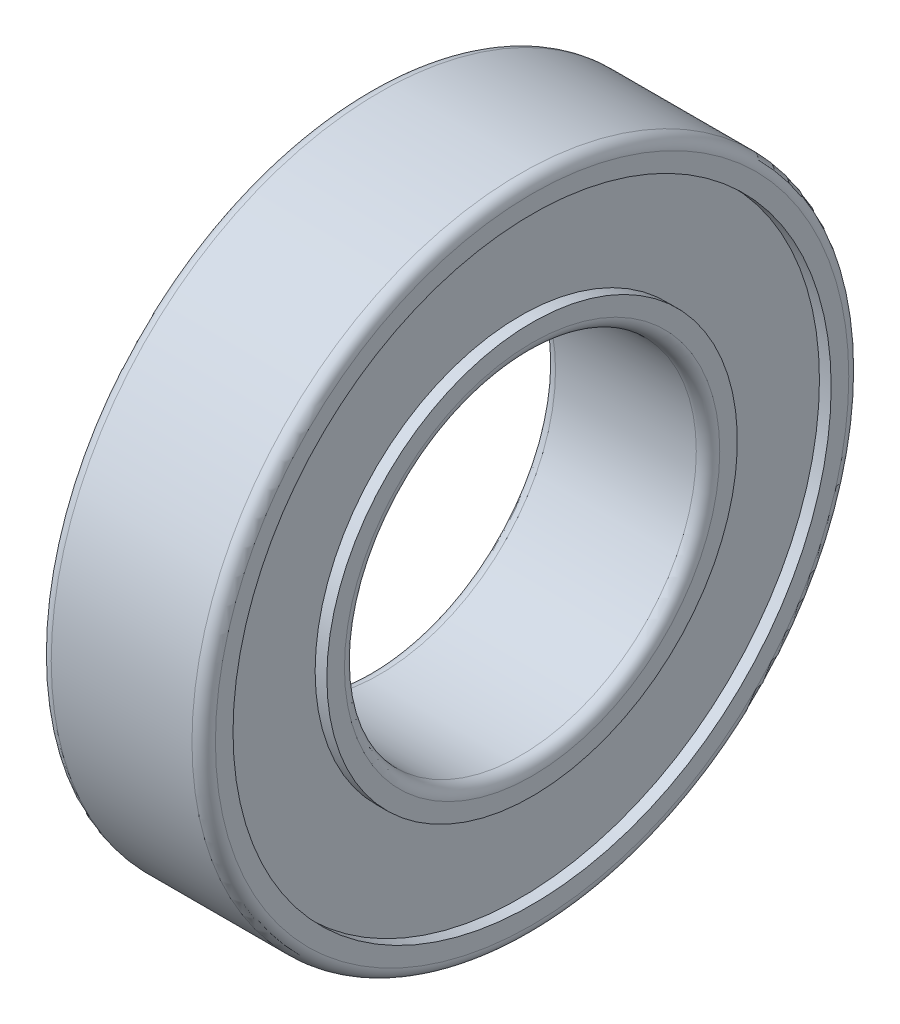
ISO-10303-21;
HEADER;
FILE_DESCRIPTION(('STEP AP214'),'2;1');
FILE_NAME('part.step','',(''),(''),'','','');
FILE_SCHEMA(('AUTOMOTIVE_DESIGN { 1 0 10303 214 1 1 1 1 }'));
ENDSEC;
DATA;
#1=APPLICATION_CONTEXT('core data for automotive mechanical design processes');
#2=APPLICATION_PROTOCOL_DEFINITION('international standard','automotive_design',2000,#1);
#3=PRODUCT_CONTEXT('',#1,'mechanical');
#4=PRODUCT('Part','Part','',(#3));
#5=PRODUCT_RELATED_PRODUCT_CATEGORY('part','',(#4));
#6=PRODUCT_DEFINITION_FORMATION('','',#4);
#7=PRODUCT_DEFINITION_CONTEXT('part definition',#1,'design');
#8=PRODUCT_DEFINITION('design','',#6,#7);
#9=PRODUCT_DEFINITION_SHAPE('','',#8);
#10=(LENGTH_UNIT() NAMED_UNIT(*) SI_UNIT(.MILLI.,.METRE.));
#11=(NAMED_UNIT(*) PLANE_ANGLE_UNIT() SI_UNIT($,.RADIAN.));
#12=(NAMED_UNIT(*) SI_UNIT($,.STERADIAN.) SOLID_ANGLE_UNIT());
#13=UNCERTAINTY_MEASURE_WITH_UNIT(LENGTH_MEASURE(1.E-05),#10,'distance_accuracy_value','');
#14=(GEOMETRIC_REPRESENTATION_CONTEXT(3) GLOBAL_UNCERTAINTY_ASSIGNED_CONTEXT((#13)) GLOBAL_UNIT_ASSIGNED_CONTEXT((#10,
#11,#12)) REPRESENTATION_CONTEXT('',''));
#15=CARTESIAN_POINT('',(0.,0.,0.));
#16=DIRECTION('',(0.,0.,1.));
#17=DIRECTION('',(1.,0.,0.));
#18=AXIS2_PLACEMENT_3D('',#15,#16,#17);
#19=CARTESIAN_POINT('',(0.,8.,0.));
#20=DIRECTION('',(-1.,0.,0.));
#21=DIRECTION('',(0.,0.,1.));
#22=AXIS2_PLACEMENT_3D('',#19,#20,#21);
#23=PLANE('',#22);
#24=CARTESIAN_POINT('',(0.,0.,0.));
#25=DIRECTION('',(-1.,0.,0.));
#26=DIRECTION('',(0.,0.,1.));
#27=AXIS2_PLACEMENT_3D('',#24,#25,#26);
#28=CIRCLE('',#27,8.75);
#29=CARTESIAN_POINT('',(0.,0.,8.75));
#30=VERTEX_POINT('',#29);
#31=EDGE_CURVE('E10',#30,#30,#28,.T.);
#32=ORIENTED_EDGE('',*,*,#31,.T.);
#33=EDGE_LOOP('',(#32));
#34=FACE_BOUND('',#33,.T.);
#35=CARTESIAN_POINT('',(0.,0.,0.));
#36=DIRECTION('',(-1.,0.,0.));
#37=DIRECTION('',(0.,0.,1.));
#38=AXIS2_PLACEMENT_3D('',#35,#36,#37);
#39=CIRCLE('',#38,8.);
#40=CARTESIAN_POINT('',(0.,0.,8.));
#41=VERTEX_POINT('',#40);
#42=EDGE_CURVE('E88',#41,#41,#39,.T.);
#43=ORIENTED_EDGE('',*,*,#42,.F.);
#44=EDGE_LOOP('',(#43));
#45=FACE_BOUND('',#44,.T.);
#46=ADVANCED_FACE('F36',(#34,#45),#23,.T.);
#47=CARTESIAN_POINT('',(7.00125000233959,0.,0.));
#48=DIRECTION('',(-1.,0.,0.));
#49=DIRECTION('',(0.,0.,1.));
#50=AXIS2_PLACEMENT_3D('',#47,#48,#49);
#51=CYLINDRICAL_SURFACE('',#50,8.75);
#52=CARTESIAN_POINT('',(0.5,0.,0.));
#53=DIRECTION('',(-1.,0.,0.));
#54=DIRECTION('',(0.,0.,1.));
#55=AXIS2_PLACEMENT_3D('',#52,#53,#54);
#56=CIRCLE('',#55,8.75);
#57=CARTESIAN_POINT('',(0.5,0.,8.75));
#58=VERTEX_POINT('',#57);
#59=EDGE_CURVE('E42',#58,#58,#56,.T.);
#60=ORIENTED_EDGE('',*,*,#59,.T.);
#61=EDGE_LOOP('',(#60));
#62=FACE_BOUND('',#61,.T.);
#63=ORIENTED_EDGE('',*,*,#31,.F.);
#64=EDGE_LOOP('',(#63));
#65=FACE_BOUND('',#64,.T.);
#66=ADVANCED_FACE('F96',(#62,#65),#51,.T.);
#67=CARTESIAN_POINT('',(0.5,8.75,0.));
#68=DIRECTION('',(-1.,0.,0.));
#69=DIRECTION('',(0.,0.,1.));
#70=AXIS2_PLACEMENT_3D('',#67,#68,#69);
#71=PLANE('',#70);
#72=CARTESIAN_POINT('',(0.5,0.,0.));
#73=DIRECTION('',(-1.,0.,0.));
#74=DIRECTION('',(0.,0.,1.));
#75=AXIS2_PLACEMENT_3D('',#72,#73,#74);
#76=CIRCLE('',#75,12.75);
#77=CARTESIAN_POINT('',(0.5,0.,12.75));
#78=VERTEX_POINT('',#77);
#79=EDGE_CURVE('E46',#78,#78,#76,.T.);
#80=ORIENTED_EDGE('',*,*,#79,.T.);
#81=EDGE_LOOP('',(#80));
#82=FACE_BOUND('',#81,.T.);
#83=ORIENTED_EDGE('',*,*,#59,.F.);
#84=EDGE_LOOP('',(#83));
#85=FACE_BOUND('',#84,.T.);
#86=ADVANCED_FACE('F100',(#82,#85),#71,.T.);
#87=CARTESIAN_POINT('',(7.00125000233959,0.,0.));
#88=DIRECTION('',(-1.,0.,0.));
#89=DIRECTION('',(0.,0.,1.));
#90=AXIS2_PLACEMENT_3D('',#87,#88,#89);
#91=CYLINDRICAL_SURFACE('',#90,12.75);
#92=CARTESIAN_POINT('',(0.,0.,0.));
#93=DIRECTION('',(-1.,0.,0.));
#94=DIRECTION('',(0.,0.,1.));
#95=AXIS2_PLACEMENT_3D('',#92,#93,#94);
#96=CIRCLE('',#95,12.75);
#97=CARTESIAN_POINT('',(0.,0.,12.75));
#98=VERTEX_POINT('',#97);
#99=EDGE_CURVE('E50',#98,#98,#96,.T.);
#100=ORIENTED_EDGE('',*,*,#99,.T.);
#101=EDGE_LOOP('',(#100));
#102=FACE_BOUND('',#101,.T.);
#103=ORIENTED_EDGE('',*,*,#79,.F.);
#104=EDGE_LOOP('',(#103));
#105=FACE_BOUND('',#104,.T.);
#106=ADVANCED_FACE('F104',(#102,#105),#91,.F.);
#107=CARTESIAN_POINT('',(0.,12.75,0.));
#108=DIRECTION('',(-1.,0.,0.));
#109=DIRECTION('',(0.,0.,1.));
#110=AXIS2_PLACEMENT_3D('',#107,#108,#109);
#111=PLANE('',#110);
#112=CARTESIAN_POINT('',(0.,0.,0.));
#113=DIRECTION('',(-1.,0.,0.));
#114=DIRECTION('',(0.,0.,1.));
#115=AXIS2_PLACEMENT_3D('',#112,#113,#114);
#116=CIRCLE('',#115,13.5);
#117=CARTESIAN_POINT('',(0.,0.,13.5));
#118=VERTEX_POINT('',#117);
#119=EDGE_CURVE('E55',#118,#118,#116,.T.);
#120=ORIENTED_EDGE('',*,*,#119,.T.);
#121=EDGE_LOOP('',(#120));
#122=FACE_BOUND('',#121,.T.);
#123=ORIENTED_EDGE('',*,*,#99,.F.);
#124=EDGE_LOOP('',(#123));
#125=FACE_BOUND('',#124,.T.);
#126=ADVANCED_FACE('F111',(#122,#125),#111,.T.);
#127=CARTESIAN_POINT('',(0.500000000000002,0.,0.));
#128=DIRECTION('',(-1.,0.,0.));
#129=DIRECTION('',(0.,0.,1.));
#130=AXIS2_PLACEMENT_3D('',#127,#128,#129);
#131=TOROIDAL_SURFACE('',#130,13.5,0.5);
#132=CARTESIAN_POINT('',(0.500000000000002,0.,0.));
#133=DIRECTION('',(-1.,0.,0.));
#134=DIRECTION('',(0.,0.,1.));
#135=AXIS2_PLACEMENT_3D('',#132,#133,#134);
#136=CIRCLE('',#135,14.);
#137=CARTESIAN_POINT('',(0.500000000000002,0.,14.));
#138=VERTEX_POINT('',#137);
#139=EDGE_CURVE('E58',#138,#138,#136,.T.);
#140=ORIENTED_EDGE('',*,*,#139,.T.);
#141=EDGE_LOOP('',(#140));
#142=FACE_BOUND('',#141,.T.);
#143=ORIENTED_EDGE('',*,*,#119,.F.);
#144=EDGE_LOOP('',(#143));
#145=FACE_BOUND('',#144,.T.);
#146=ADVANCED_FACE('F115',(#142,#145),#131,.T.);
#147=CARTESIAN_POINT('',(7.00125000233959,0.,0.));
#148=DIRECTION('',(-1.,0.,0.));
#149=DIRECTION('',(0.,0.,1.));
#150=AXIS2_PLACEMENT_3D('',#147,#148,#149);
#151=CYLINDRICAL_SURFACE('',#150,14.);
#152=CARTESIAN_POINT('',(6.5,0.,0.));
#153=DIRECTION('',(-1.,0.,0.));
#154=DIRECTION('',(0.,0.,1.));
#155=AXIS2_PLACEMENT_3D('',#152,#153,#154);
#156=CIRCLE('',#155,14.);
#157=CARTESIAN_POINT('',(6.5,0.,14.));
#158=VERTEX_POINT('',#157);
#159=EDGE_CURVE('E61',#158,#158,#156,.T.);
#160=ORIENTED_EDGE('',*,*,#159,.T.);
#161=EDGE_LOOP('',(#160));
#162=FACE_BOUND('',#161,.T.);
#163=ORIENTED_EDGE('',*,*,#139,.F.);
#164=EDGE_LOOP('',(#163));
#165=FACE_BOUND('',#164,.T.);
#166=ADVANCED_FACE('F119',(#162,#165),#151,.T.);
#167=CARTESIAN_POINT('',(6.5,0.,0.));
#168=DIRECTION('',(-1.,0.,0.));
#169=DIRECTION('',(0.,0.,1.));
#170=AXIS2_PLACEMENT_3D('',#167,#168,#169);
#171=TOROIDAL_SURFACE('',#170,13.5,0.5);
#172=CARTESIAN_POINT('',(7.,0.,0.));
#173=DIRECTION('',(-1.,0.,0.));
#174=DIRECTION('',(0.,0.,1.));
#175=AXIS2_PLACEMENT_3D('',#172,#173,#174);
#176=CIRCLE('',#175,13.5);
#177=CARTESIAN_POINT('',(7.,0.,13.5));
#178=VERTEX_POINT('',#177);
#179=EDGE_CURVE('E64',#178,#178,#176,.T.);
#180=ORIENTED_EDGE('',*,*,#179,.T.);
#181=EDGE_LOOP('',(#180));
#182=FACE_BOUND('',#181,.T.);
#183=ORIENTED_EDGE('',*,*,#159,.F.);
#184=EDGE_LOOP('',(#183));
#185=FACE_BOUND('',#184,.T.);
#186=ADVANCED_FACE('F123',(#182,#185),#171,.T.);
#187=CARTESIAN_POINT('',(7.,13.5,0.));
#188=DIRECTION('',(1.,0.,0.));
#189=DIRECTION('',(0.,0.,-1.));
#190=AXIS2_PLACEMENT_3D('',#187,#188,#189);
#191=PLANE('',#190);
#192=CARTESIAN_POINT('',(7.,0.,0.));
#193=DIRECTION('',(-1.,0.,0.));
#194=DIRECTION('',(0.,0.,1.));
#195=AXIS2_PLACEMENT_3D('',#192,#193,#194);
#196=CIRCLE('',#195,12.75);
#197=CARTESIAN_POINT('',(7.,0.,12.75));
#198=VERTEX_POINT('',#197);
#199=EDGE_CURVE('E67',#198,#198,#196,.T.);
#200=ORIENTED_EDGE('',*,*,#199,.T.);
#201=EDGE_LOOP('',(#200));
#202=FACE_BOUND('',#201,.T.);
#203=ORIENTED_EDGE('',*,*,#179,.F.);
#204=EDGE_LOOP('',(#203));
#205=FACE_BOUND('',#204,.T.);
#206=ADVANCED_FACE('F127',(#202,#205),#191,.T.);
#207=CARTESIAN_POINT('',(7.00125000233959,0.,0.));
#208=DIRECTION('',(-1.,0.,0.));
#209=DIRECTION('',(0.,0.,1.));
#210=AXIS2_PLACEMENT_3D('',#207,#208,#209);
#211=CYLINDRICAL_SURFACE('',#210,12.75);
#212=CARTESIAN_POINT('',(6.5,0.,0.));
#213=DIRECTION('',(-1.,0.,0.));
#214=DIRECTION('',(0.,0.,1.));
#215=AXIS2_PLACEMENT_3D('',#212,#213,#214);
#216=CIRCLE('',#215,12.75);
#217=CARTESIAN_POINT('',(6.5,0.,12.75));
#218=VERTEX_POINT('',#217);
#219=EDGE_CURVE('E70',#218,#218,#216,.T.);
#220=ORIENTED_EDGE('',*,*,#219,.T.);
#221=EDGE_LOOP('',(#220));
#222=FACE_BOUND('',#221,.T.);
#223=ORIENTED_EDGE('',*,*,#199,.F.);
#224=EDGE_LOOP('',(#223));
#225=FACE_BOUND('',#224,.T.);
#226=ADVANCED_FACE('F131',(#222,#225),#211,.F.);
#227=CARTESIAN_POINT('',(6.5,12.75,0.));
#228=DIRECTION('',(1.,0.,0.));
#229=DIRECTION('',(0.,0.,-1.));
#230=AXIS2_PLACEMENT_3D('',#227,#228,#229);
#231=PLANE('',#230);
#232=CARTESIAN_POINT('',(6.5,0.,0.));
#233=DIRECTION('',(-1.,0.,0.));
#234=DIRECTION('',(0.,0.,1.));
#235=AXIS2_PLACEMENT_3D('',#232,#233,#234);
#236=CIRCLE('',#235,8.75);
#237=CARTESIAN_POINT('',(6.5,0.,8.75));
#238=VERTEX_POINT('',#237);
#239=EDGE_CURVE('E73',#238,#238,#236,.T.);
#240=ORIENTED_EDGE('',*,*,#239,.T.);
#241=EDGE_LOOP('',(#240));
#242=FACE_BOUND('',#241,.T.);
#243=ORIENTED_EDGE('',*,*,#219,.F.);
#244=EDGE_LOOP('',(#243));
#245=FACE_BOUND('',#244,.T.);
#246=ADVANCED_FACE('F135',(#242,#245),#231,.T.);
#247=CARTESIAN_POINT('',(7.00125000233959,0.,0.));
#248=DIRECTION('',(-1.,0.,0.));
#249=DIRECTION('',(0.,0.,1.));
#250=AXIS2_PLACEMENT_3D('',#247,#248,#249);
#251=CYLINDRICAL_SURFACE('',#250,8.75);
#252=CARTESIAN_POINT('',(7.,0.,0.));
#253=DIRECTION('',(-1.,0.,0.));
#254=DIRECTION('',(0.,0.,1.));
#255=AXIS2_PLACEMENT_3D('',#252,#253,#254);
#256=CIRCLE('',#255,8.75);
#257=CARTESIAN_POINT('',(7.,0.,8.75));
#258=VERTEX_POINT('',#257);
#259=EDGE_CURVE('E76',#258,#258,#256,.T.);
#260=ORIENTED_EDGE('',*,*,#259,.T.);
#261=EDGE_LOOP('',(#260));
#262=FACE_BOUND('',#261,.T.);
#263=ORIENTED_EDGE('',*,*,#239,.F.);
#264=EDGE_LOOP('',(#263));
#265=FACE_BOUND('',#264,.T.);
#266=ADVANCED_FACE('F139',(#262,#265),#251,.T.);
#267=CARTESIAN_POINT('',(7.,8.75,0.));
#268=DIRECTION('',(1.,0.,0.));
#269=DIRECTION('',(0.,0.,-1.));
#270=AXIS2_PLACEMENT_3D('',#267,#268,#269);
#271=PLANE('',#270);
#272=CARTESIAN_POINT('',(7.,0.,0.));
#273=DIRECTION('',(-1.,0.,0.));
#274=DIRECTION('',(0.,0.,1.));
#275=AXIS2_PLACEMENT_3D('',#272,#273,#274);
#276=CIRCLE('',#275,8.00000000000006);
#277=CARTESIAN_POINT('',(7.,0.,8.00000000000006));
#278=VERTEX_POINT('',#277);
#279=EDGE_CURVE('E79',#278,#278,#276,.T.);
#280=ORIENTED_EDGE('',*,*,#279,.T.);
#281=EDGE_LOOP('',(#280));
#282=FACE_BOUND('',#281,.T.);
#283=ORIENTED_EDGE('',*,*,#259,.F.);
#284=EDGE_LOOP('',(#283));
#285=FACE_BOUND('',#284,.T.);
#286=ADVANCED_FACE('F143',(#282,#285),#271,.T.);
#287=CARTESIAN_POINT('',(6.5,0.,0.));
#288=DIRECTION('',(-1.,0.,0.));
#289=DIRECTION('',(0.,0.,1.));
#290=AXIS2_PLACEMENT_3D('',#287,#288,#289);
#291=TOROIDAL_SURFACE('',#290,8.,0.5);
#292=CARTESIAN_POINT('',(6.5,0.,0.));
#293=DIRECTION('',(-1.,0.,0.));
#294=DIRECTION('',(0.,0.,1.));
#295=AXIS2_PLACEMENT_3D('',#292,#293,#294);
#296=CIRCLE('',#295,7.5);
#297=CARTESIAN_POINT('',(6.5,0.,7.5));
#298=VERTEX_POINT('',#297);
#299=EDGE_CURVE('E82',#298,#298,#296,.T.);
#300=ORIENTED_EDGE('',*,*,#299,.T.);
#301=EDGE_LOOP('',(#300));
#302=FACE_BOUND('',#301,.T.);
#303=ORIENTED_EDGE('',*,*,#279,.F.);
#304=EDGE_LOOP('',(#303));
#305=FACE_BOUND('',#304,.T.);
#306=ADVANCED_FACE('F147',(#302,#305),#291,.T.);
#307=CARTESIAN_POINT('',(7.00125000233959,0.,0.));
#308=DIRECTION('',(-1.,0.,0.));
#309=DIRECTION('',(0.,0.,1.));
#310=AXIS2_PLACEMENT_3D('',#307,#308,#309);
#311=CYLINDRICAL_SURFACE('',#310,7.5);
#312=CARTESIAN_POINT('',(0.5,0.,0.));
#313=DIRECTION('',(-1.,0.,0.));
#314=DIRECTION('',(0.,0.,1.));
#315=AXIS2_PLACEMENT_3D('',#312,#313,#314);
#316=CIRCLE('',#315,7.5);
#317=CARTESIAN_POINT('',(0.5,0.,7.5));
#318=VERTEX_POINT('',#317);
#319=EDGE_CURVE('E85',#318,#318,#316,.T.);
#320=ORIENTED_EDGE('',*,*,#319,.T.);
#321=EDGE_LOOP('',(#320));
#322=FACE_BOUND('',#321,.T.);
#323=ORIENTED_EDGE('',*,*,#299,.F.);
#324=EDGE_LOOP('',(#323));
#325=FACE_BOUND('',#324,.T.);
#326=ADVANCED_FACE('F151',(#322,#325),#311,.F.);
#327=CARTESIAN_POINT('',(0.5,0.,0.));
#328=DIRECTION('',(-1.,0.,0.));
#329=DIRECTION('',(0.,0.,1.));
#330=AXIS2_PLACEMENT_3D('',#327,#328,#329);
#331=TOROIDAL_SURFACE('',#330,8.,0.500000000000001);
#332=ORIENTED_EDGE('',*,*,#42,.T.);
#333=EDGE_LOOP('',(#332));
#334=FACE_BOUND('',#333,.T.);
#335=ORIENTED_EDGE('',*,*,#319,.F.);
#336=EDGE_LOOP('',(#335));
#337=FACE_BOUND('',#336,.T.);
#338=ADVANCED_FACE('F92',(#334,#337),#331,.T.);
#339=CLOSED_SHELL('',(#46,#66,#86,#106,#126,#146,#166,#186,#206,#226,#246,#266,#286,#306,#326,#338));
#340=MANIFOLD_SOLID_BREP('B2',#339);
#341=ADVANCED_BREP_SHAPE_REPRESENTATION('',(#18,#340),#14);
#342=SHAPE_DEFINITION_REPRESENTATION(#9,#341);
ENDSEC;
END-ISO-10303-21;
